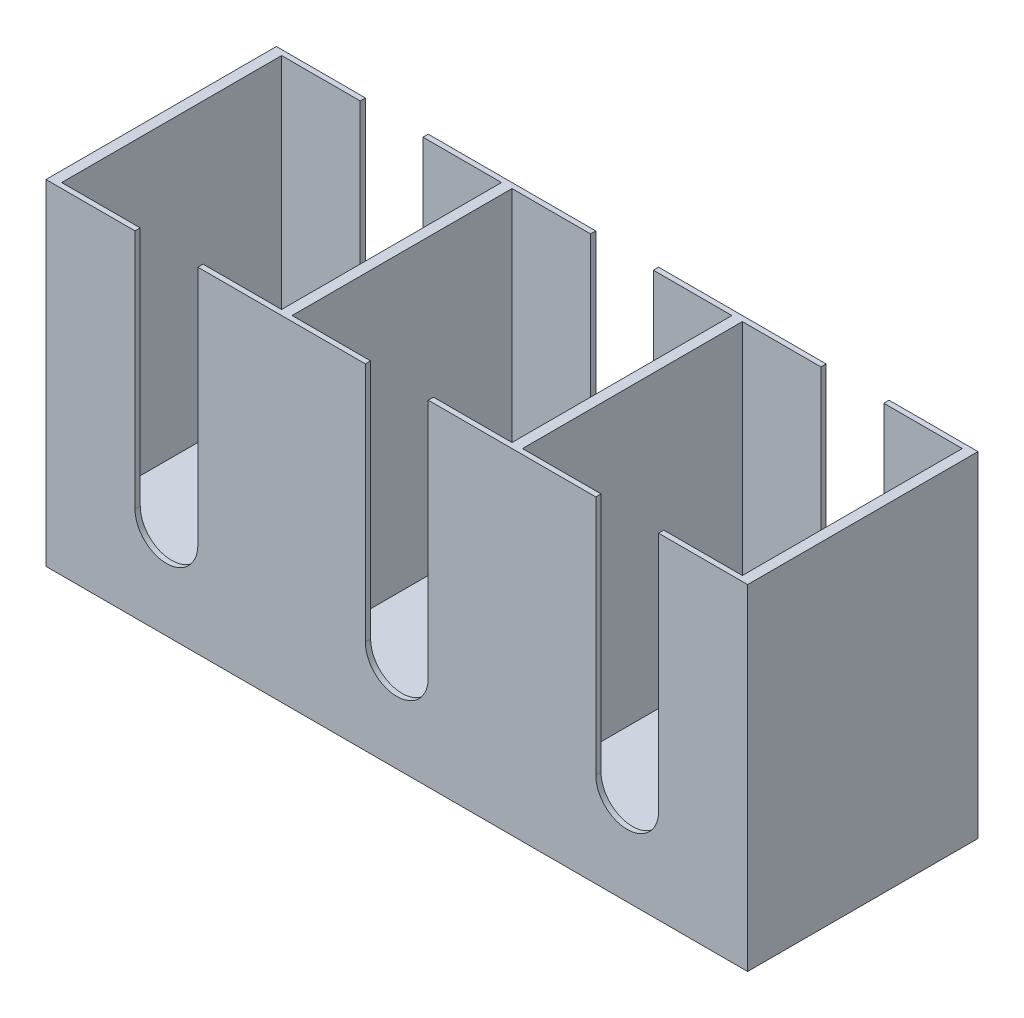
ISO-10303-21;
HEADER;
FILE_DESCRIPTION(('STEP AP214'),'2;1');
FILE_NAME('part.step','',(''),(''),'','','');
FILE_SCHEMA(('AUTOMOTIVE_DESIGN { 1 0 10303 214 1 1 1 1 }'));
ENDSEC;
DATA;
#1=APPLICATION_CONTEXT('core data for automotive mechanical design processes');
#2=APPLICATION_PROTOCOL_DEFINITION('international standard','automotive_design',2000,#1);
#3=PRODUCT_CONTEXT('',#1,'mechanical');
#4=PRODUCT('Part','Part','',(#3));
#5=PRODUCT_RELATED_PRODUCT_CATEGORY('part','',(#4));
#6=PRODUCT_DEFINITION_FORMATION('','',#4);
#7=PRODUCT_DEFINITION_CONTEXT('part definition',#1,'design');
#8=PRODUCT_DEFINITION('design','',#6,#7);
#9=PRODUCT_DEFINITION_SHAPE('','',#8);
#10=(LENGTH_UNIT() NAMED_UNIT(*) SI_UNIT(.MILLI.,.METRE.));
#11=(NAMED_UNIT(*) PLANE_ANGLE_UNIT() SI_UNIT($,.RADIAN.));
#12=(NAMED_UNIT(*) SI_UNIT($,.STERADIAN.) SOLID_ANGLE_UNIT());
#13=UNCERTAINTY_MEASURE_WITH_UNIT(LENGTH_MEASURE(1.E-05),#10,'distance_accuracy_value','');
#14=(GEOMETRIC_REPRESENTATION_CONTEXT(3) GLOBAL_UNCERTAINTY_ASSIGNED_CONTEXT((#13)) GLOBAL_UNIT_ASSIGNED_CONTEXT((#10,
#11,#12)) REPRESENTATION_CONTEXT('',''));
#15=CARTESIAN_POINT('',(0.,0.,0.));
#16=DIRECTION('',(0.,0.,1.));
#17=DIRECTION('',(1.,0.,0.));
#18=AXIS2_PLACEMENT_3D('',#15,#16,#17);
#19=CARTESIAN_POINT('',(0.,32.,0.));
#20=DIRECTION('',(0.,1.,0.));
#21=DIRECTION('',(0.,0.,1.));
#22=AXIS2_PLACEMENT_3D('',#19,#20,#21);
#23=PLANE('',#22);
#24=DIRECTION('',(0.,0.,1.));
#25=VECTOR('',#24,1.);
#26=CARTESIAN_POINT('',(-19.,32.,-11.));
#27=LINE('',#26,#25);
#28=CARTESIAN_POINT('',(-19.,32.,10.5));
#29=VERTEX_POINT('',#28);
#30=CARTESIAN_POINT('',(-19.,32.,11.));
#31=VERTEX_POINT('',#30);
#32=EDGE_CURVE('E624',#29,#31,#27,.T.);
#33=ORIENTED_EDGE('',*,*,#32,.T.);
#34=DIRECTION('',(1.,0.,0.));
#35=VECTOR('',#34,1.);
#36=CARTESIAN_POINT('',(-33.5,32.,11.));
#37=LINE('',#36,#35);
#38=CARTESIAN_POINT('',(-2.99999999999999,32.,11.));
#39=VERTEX_POINT('',#38);
#40=EDGE_CURVE('E596',#31,#39,#37,.T.);
#41=ORIENTED_EDGE('',*,*,#40,.T.);
#42=DIRECTION('',(0.,0.,1.));
#43=VECTOR('',#42,1.);
#44=CARTESIAN_POINT('',(-2.99999999999999,32.,-11.));
#45=LINE('',#44,#43);
#46=CARTESIAN_POINT('',(-2.99999999999999,32.,10.5));
#47=VERTEX_POINT('',#46);
#48=EDGE_CURVE('E367',#47,#39,#45,.T.);
#49=ORIENTED_EDGE('',*,*,#48,.F.);
#50=DIRECTION('',(1.,0.,0.));
#51=VECTOR('',#50,1.);
#52=CARTESIAN_POINT('',(-10.5,32.,10.5));
#53=LINE('',#52,#51);
#54=CARTESIAN_POINT('',(-10.5,32.,10.5));
#55=VERTEX_POINT('',#54);
#56=EDGE_CURVE('E501',#55,#47,#53,.T.);
#57=ORIENTED_EDGE('',*,*,#56,.F.);
#58=DIRECTION('',(0.,0.,1.));
#59=VECTOR('',#58,1.);
#60=CARTESIAN_POINT('',(-10.5,32.,-10.5));
#61=LINE('',#60,#59);
#62=CARTESIAN_POINT('',(-10.5,32.,-10.5));
#63=VERTEX_POINT('',#62);
#64=EDGE_CURVE('E509',#63,#55,#61,.T.);
#65=ORIENTED_EDGE('',*,*,#64,.F.);
#66=DIRECTION('',(-1.,0.,0.));
#67=VECTOR('',#66,1.);
#68=CARTESIAN_POINT('',(-10.5,32.,-10.5));
#69=LINE('',#68,#67);
#70=CARTESIAN_POINT('',(-3.,32.,-10.5));
#71=VERTEX_POINT('',#70);
#72=EDGE_CURVE('E506',#71,#63,#69,.T.);
#73=ORIENTED_EDGE('',*,*,#72,.F.);
#74=CARTESIAN_POINT('',(-2.99999999999999,32.,-11.));
#75=VERTEX_POINT('',#74);
#76=EDGE_CURVE('E65',#75,#71,#45,.T.);
#77=ORIENTED_EDGE('',*,*,#76,.F.);
#78=DIRECTION('',(-1.,0.,0.));
#79=VECTOR('',#78,1.);
#80=CARTESIAN_POINT('',(-33.5,32.,-11.));
#81=LINE('',#80,#79);
#82=CARTESIAN_POINT('',(-19.,32.,-11.));
#83=VERTEX_POINT('',#82);
#84=EDGE_CURVE('E325',#75,#83,#81,.T.);
#85=ORIENTED_EDGE('',*,*,#84,.T.);
#86=CARTESIAN_POINT('',(-19.,32.,-10.5));
#87=VERTEX_POINT('',#86);
#88=EDGE_CURVE('E406',#83,#87,#27,.T.);
#89=ORIENTED_EDGE('',*,*,#88,.T.);
#90=DIRECTION('',(-1.,0.,0.));
#91=VECTOR('',#90,1.);
#92=CARTESIAN_POINT('',(-32.5,32.,-10.5));
#93=LINE('',#92,#91);
#94=CARTESIAN_POINT('',(-11.5,32.,-10.5));
#95=VERTEX_POINT('',#94);
#96=EDGE_CURVE('E479',#95,#87,#93,.T.);
#97=ORIENTED_EDGE('',*,*,#96,.F.);
#98=DIRECTION('',(0.,0.,-1.));
#99=VECTOR('',#98,1.);
#100=CARTESIAN_POINT('',(-11.5,32.,-10.5));
#101=LINE('',#100,#99);
#102=CARTESIAN_POINT('',(-11.5,32.,10.5));
#103=VERTEX_POINT('',#102);
#104=EDGE_CURVE('E477',#103,#95,#101,.T.);
#105=ORIENTED_EDGE('',*,*,#104,.F.);
#106=DIRECTION('',(1.,0.,0.));
#107=VECTOR('',#106,1.);
#108=CARTESIAN_POINT('',(-32.5,32.,10.5));
#109=LINE('',#108,#107);
#110=EDGE_CURVE('E485',#29,#103,#109,.T.);
#111=ORIENTED_EDGE('',*,*,#110,.F.);
#112=EDGE_LOOP('',(#33,#41,#49,#57,#65,#73,#77,#85,#89,#97,#105,#111));
#113=FACE_BOUND('',#112,.T.);
#114=ADVANCED_FACE('F42',(#113),#23,.T.);
#115=DIRECTION('',(0.,0.,1.));
#116=VECTOR('',#115,1.);
#117=CARTESIAN_POINT('',(3.,32.,-11.));
#118=LINE('',#117,#116);
#119=CARTESIAN_POINT('',(3.,32.,10.5));
#120=VERTEX_POINT('',#119);
#121=CARTESIAN_POINT('',(3.,32.,11.));
#122=VERTEX_POINT('',#121);
#123=EDGE_CURVE('E397',#120,#122,#118,.T.);
#124=ORIENTED_EDGE('',*,*,#123,.T.);
#125=CARTESIAN_POINT('',(19.,32.,11.));
#126=VERTEX_POINT('',#125);
#127=EDGE_CURVE('E707',#122,#126,#37,.T.);
#128=ORIENTED_EDGE('',*,*,#127,.T.);
#129=DIRECTION('',(0.,0.,1.));
#130=VECTOR('',#129,1.);
#131=CARTESIAN_POINT('',(19.,32.,-11.));
#132=LINE('',#131,#130);
#133=CARTESIAN_POINT('',(19.,32.,10.5));
#134=VERTEX_POINT('',#133);
#135=EDGE_CURVE('E377',#134,#126,#132,.T.);
#136=ORIENTED_EDGE('',*,*,#135,.F.);
#137=DIRECTION('',(1.,0.,0.));
#138=VECTOR('',#137,1.);
#139=CARTESIAN_POINT('',(11.5,32.,10.5));
#140=LINE('',#139,#138);
#141=CARTESIAN_POINT('',(11.5,32.,10.5));
#142=VERTEX_POINT('',#141);
#143=EDGE_CURVE('E455',#142,#134,#140,.T.);
#144=ORIENTED_EDGE('',*,*,#143,.F.);
#145=DIRECTION('',(0.,0.,1.));
#146=VECTOR('',#145,1.);
#147=CARTESIAN_POINT('',(11.5,32.,-10.5));
#148=LINE('',#147,#146);
#149=CARTESIAN_POINT('',(11.5,32.,-10.5));
#150=VERTEX_POINT('',#149);
#151=EDGE_CURVE('E464',#150,#142,#148,.T.);
#152=ORIENTED_EDGE('',*,*,#151,.F.);
#153=DIRECTION('',(-1.,0.,0.));
#154=VECTOR('',#153,1.);
#155=CARTESIAN_POINT('',(11.5,32.,-10.5));
#156=LINE('',#155,#154);
#157=CARTESIAN_POINT('',(19.,32.,-10.5));
#158=VERTEX_POINT('',#157);
#159=EDGE_CURVE('E460',#158,#150,#156,.T.);
#160=ORIENTED_EDGE('',*,*,#159,.F.);
#161=CARTESIAN_POINT('',(19.,32.,-11.));
#162=VERTEX_POINT('',#161);
#163=EDGE_CURVE('E351',#162,#158,#132,.T.);
#164=ORIENTED_EDGE('',*,*,#163,.F.);
#165=CARTESIAN_POINT('',(3.,32.,-11.));
#166=VERTEX_POINT('',#165);
#167=EDGE_CURVE('E330',#162,#166,#81,.T.);
#168=ORIENTED_EDGE('',*,*,#167,.T.);
#169=CARTESIAN_POINT('',(3.,32.,-10.5));
#170=VERTEX_POINT('',#169);
#171=EDGE_CURVE('E348',#166,#170,#118,.T.);
#172=ORIENTED_EDGE('',*,*,#171,.T.);
#173=CARTESIAN_POINT('',(10.5,32.,-10.5));
#174=VERTEX_POINT('',#173);
#175=EDGE_CURVE('E507',#174,#170,#69,.T.);
#176=ORIENTED_EDGE('',*,*,#175,.F.);
#177=DIRECTION('',(0.,0.,-1.));
#178=VECTOR('',#177,1.);
#179=CARTESIAN_POINT('',(10.5,32.,-10.5));
#180=LINE('',#179,#178);
#181=CARTESIAN_POINT('',(10.5,32.,10.5));
#182=VERTEX_POINT('',#181);
#183=EDGE_CURVE('E504',#182,#174,#180,.T.);
#184=ORIENTED_EDGE('',*,*,#183,.F.);
#185=EDGE_CURVE('E500',#120,#182,#53,.T.);
#186=ORIENTED_EDGE('',*,*,#185,.F.);
#187=EDGE_LOOP('',(#124,#128,#136,#144,#152,#160,#164,#168,#172,#176,#184,#186));
#188=FACE_BOUND('',#187,.T.);
#189=ADVANCED_FACE('F346',(#188),#23,.T.);
#190=DIRECTION('',(0.,0.,1.));
#191=VECTOR('',#190,1.);
#192=CARTESIAN_POINT('',(25.,32.,-11.));
#193=LINE('',#192,#191);
#194=CARTESIAN_POINT('',(25.,32.,10.5));
#195=VERTEX_POINT('',#194);
#196=CARTESIAN_POINT('',(25.,32.,11.));
#197=VERTEX_POINT('',#196);
#198=EDGE_CURVE('E388',#195,#197,#193,.T.);
#199=ORIENTED_EDGE('',*,*,#198,.T.);
#200=CARTESIAN_POINT('',(33.5,32.,11.));
#201=VERTEX_POINT('',#200);
#202=EDGE_CURVE('E339',#197,#201,#37,.T.);
#203=ORIENTED_EDGE('',*,*,#202,.T.);
#204=DIRECTION('',(0.,0.,-1.));
#205=VECTOR('',#204,1.);
#206=CARTESIAN_POINT('',(33.5,32.,-11.));
#207=LINE('',#206,#205);
#208=CARTESIAN_POINT('',(33.5,32.,-11.));
#209=VERTEX_POINT('',#208);
#210=EDGE_CURVE('E326',#201,#209,#207,.T.);
#211=ORIENTED_EDGE('',*,*,#210,.T.);
#212=CARTESIAN_POINT('',(25.,32.,-11.));
#213=VERTEX_POINT('',#212);
#214=EDGE_CURVE('E328',#209,#213,#81,.T.);
#215=ORIENTED_EDGE('',*,*,#214,.T.);
#216=CARTESIAN_POINT('',(25.,32.,-10.5));
#217=VERTEX_POINT('',#216);
#218=EDGE_CURVE('E386',#213,#217,#193,.T.);
#219=ORIENTED_EDGE('',*,*,#218,.T.);
#220=CARTESIAN_POINT('',(32.5,32.,-10.5));
#221=VERTEX_POINT('',#220);
#222=EDGE_CURVE('E461',#221,#217,#156,.T.);
#223=ORIENTED_EDGE('',*,*,#222,.F.);
#224=DIRECTION('',(0.,0.,-1.));
#225=VECTOR('',#224,1.);
#226=CARTESIAN_POINT('',(32.5,32.,-10.5));
#227=LINE('',#226,#225);
#228=CARTESIAN_POINT('',(32.5,32.,10.5));
#229=VERTEX_POINT('',#228);
#230=EDGE_CURVE('E458',#229,#221,#227,.T.);
#231=ORIENTED_EDGE('',*,*,#230,.F.);
#232=EDGE_CURVE('E454',#195,#229,#140,.T.);
#233=ORIENTED_EDGE('',*,*,#232,.F.);
#234=EDGE_LOOP('',(#199,#203,#211,#215,#219,#223,#231,#233));
#235=FACE_BOUND('',#234,.T.);
#236=ADVANCED_FACE('F683',(#235),#23,.T.);
#237=DIRECTION('',(0.,0.,1.));
#238=VECTOR('',#237,1.);
#239=CARTESIAN_POINT('',(-25.,32.,-11.));
#240=LINE('',#239,#238);
#241=CARTESIAN_POINT('',(-25.,32.,-11.));
#242=VERTEX_POINT('',#241);
#243=CARTESIAN_POINT('',(-25.,32.,-10.5));
#244=VERTEX_POINT('',#243);
#245=EDGE_CURVE('E300',#242,#244,#240,.T.);
#246=ORIENTED_EDGE('',*,*,#245,.F.);
#247=CARTESIAN_POINT('',(-33.5,32.,-11.));
#248=VERTEX_POINT('',#247);
#249=EDGE_CURVE('E314',#242,#248,#81,.T.);
#250=ORIENTED_EDGE('',*,*,#249,.T.);
#251=DIRECTION('',(0.,0.,1.));
#252=VECTOR('',#251,1.);
#253=CARTESIAN_POINT('',(-33.5,32.,-11.));
#254=LINE('',#253,#252);
#255=CARTESIAN_POINT('',(-33.5,32.,11.));
#256=VERTEX_POINT('',#255);
#257=EDGE_CURVE('E336',#248,#256,#254,.T.);
#258=ORIENTED_EDGE('',*,*,#257,.T.);
#259=CARTESIAN_POINT('',(-25.,32.,11.));
#260=VERTEX_POINT('',#259);
#261=EDGE_CURVE('E535',#256,#260,#37,.T.);
#262=ORIENTED_EDGE('',*,*,#261,.T.);
#263=CARTESIAN_POINT('',(-25.,32.,10.5));
#264=VERTEX_POINT('',#263);
#265=EDGE_CURVE('E319',#264,#260,#240,.T.);
#266=ORIENTED_EDGE('',*,*,#265,.F.);
#267=CARTESIAN_POINT('',(-32.5,32.,10.5));
#268=VERTEX_POINT('',#267);
#269=EDGE_CURVE('E486',#268,#264,#109,.T.);
#270=ORIENTED_EDGE('',*,*,#269,.F.);
#271=DIRECTION('',(0.,0.,1.));
#272=VECTOR('',#271,1.);
#273=CARTESIAN_POINT('',(-32.5,32.,-10.5));
#274=LINE('',#273,#272);
#275=CARTESIAN_POINT('',(-32.5,32.,-10.5));
#276=VERTEX_POINT('',#275);
#277=EDGE_CURVE('E482',#276,#268,#274,.T.);
#278=ORIENTED_EDGE('',*,*,#277,.F.);
#279=EDGE_CURVE('E317',#244,#276,#93,.T.);
#280=ORIENTED_EDGE('',*,*,#279,.F.);
#281=EDGE_LOOP('',(#246,#250,#258,#262,#266,#270,#278,#280));
#282=FACE_BOUND('',#281,.T.);
#283=ADVANCED_FACE('F313',(#282),#23,.T.);
#284=CARTESIAN_POINT('',(0.,0.,0.));
#285=DIRECTION('',(0.,1.,0.));
#286=DIRECTION('',(0.,0.,1.));
#287=AXIS2_PLACEMENT_3D('',#284,#285,#286);
#288=PLANE('',#287);
#289=DIRECTION('',(0.,0.,-1.));
#290=VECTOR('',#289,1.);
#291=CARTESIAN_POINT('',(33.5,0.,-11.));
#292=LINE('',#291,#290);
#293=CARTESIAN_POINT('',(33.5,0.,11.));
#294=VERTEX_POINT('',#293);
#295=CARTESIAN_POINT('',(33.5,0.,-11.));
#296=VERTEX_POINT('',#295);
#297=EDGE_CURVE('E521',#294,#296,#292,.T.);
#298=ORIENTED_EDGE('',*,*,#297,.F.);
#299=DIRECTION('',(1.,0.,0.));
#300=VECTOR('',#299,1.);
#301=CARTESIAN_POINT('',(-33.5,0.,11.));
#302=LINE('',#301,#300);
#303=CARTESIAN_POINT('',(-33.5,0.,11.));
#304=VERTEX_POINT('',#303);
#305=EDGE_CURVE('E332',#304,#294,#302,.T.);
#306=ORIENTED_EDGE('',*,*,#305,.F.);
#307=DIRECTION('',(0.,0.,1.));
#308=VECTOR('',#307,1.);
#309=CARTESIAN_POINT('',(-33.5,0.,-11.));
#310=LINE('',#309,#308);
#311=CARTESIAN_POINT('',(-33.5,0.,-11.));
#312=VERTEX_POINT('',#311);
#313=EDGE_CURVE('E532',#312,#304,#310,.T.);
#314=ORIENTED_EDGE('',*,*,#313,.F.);
#315=DIRECTION('',(-1.,0.,0.));
#316=VECTOR('',#315,1.);
#317=CARTESIAN_POINT('',(-33.5,0.,-11.));
#318=LINE('',#317,#316);
#319=EDGE_CURVE('E526',#296,#312,#318,.T.);
#320=ORIENTED_EDGE('',*,*,#319,.F.);
#321=EDGE_LOOP('',(#298,#306,#314,#320));
#322=FACE_BOUND('',#321,.T.);
#323=ADVANCED_FACE('F687',(#322),#288,.F.);
#324=CARTESIAN_POINT('',(33.5,32.,-11.));
#325=DIRECTION('',(-1.,0.,0.));
#326=DIRECTION('',(0.,0.,1.));
#327=AXIS2_PLACEMENT_3D('',#324,#325,#326);
#328=PLANE('',#327);
#329=ORIENTED_EDGE('',*,*,#297,.T.);
#330=DIRECTION('',(0.,-1.,0.));
#331=VECTOR('',#330,1.);
#332=CARTESIAN_POINT('',(33.5,32.,-11.));
#333=LINE('',#332,#331);
#334=EDGE_CURVE('E545',#209,#296,#333,.T.);
#335=ORIENTED_EDGE('',*,*,#334,.F.);
#336=ORIENTED_EDGE('',*,*,#210,.F.);
#337=DIRECTION('',(0.,-1.,0.));
#338=VECTOR('',#337,1.);
#339=CARTESIAN_POINT('',(33.5,32.,11.));
#340=LINE('',#339,#338);
#341=EDGE_CURVE('E539',#201,#294,#340,.T.);
#342=ORIENTED_EDGE('',*,*,#341,.T.);
#343=EDGE_LOOP('',(#329,#335,#336,#342));
#344=FACE_BOUND('',#343,.T.);
#345=ADVANCED_FACE('F44',(#344),#328,.F.);
#346=CARTESIAN_POINT('',(-33.5,32.,-11.));
#347=DIRECTION('',(0.,0.,1.));
#348=DIRECTION('',(1.,0.,0.));
#349=AXIS2_PLACEMENT_3D('',#346,#347,#348);
#350=PLANE('',#349);
#351=CARTESIAN_POINT('',(-22.,9.,-11.));
#352=DIRECTION('',(0.,0.,1.));
#353=DIRECTION('',(1.,0.,0.));
#354=AXIS2_PLACEMENT_3D('',#351,#352,#353);
#355=CIRCLE('',#354,3.);
#356=CARTESIAN_POINT('',(-25.,9.,-11.));
#357=VERTEX_POINT('',#356);
#358=CARTESIAN_POINT('',(-19.,9.,-11.));
#359=VERTEX_POINT('',#358);
#360=EDGE_CURVE('E308',#357,#359,#355,.T.);
#361=ORIENTED_EDGE('',*,*,#360,.T.);
#362=DIRECTION('',(0.,1.,0.));
#363=VECTOR('',#362,1.);
#364=CARTESIAN_POINT('',(-19.,9.,-11.));
#365=LINE('',#364,#363);
#366=EDGE_CURVE('E618',#359,#83,#365,.T.);
#367=ORIENTED_EDGE('',*,*,#366,.T.);
#368=ORIENTED_EDGE('',*,*,#84,.F.);
#369=DIRECTION('',(0.,-1.,0.));
#370=VECTOR('',#369,1.);
#371=CARTESIAN_POINT('',(-2.99999999999999,32.,-11.));
#372=LINE('',#371,#370);
#373=CARTESIAN_POINT('',(-3.,9.,-11.));
#374=VERTEX_POINT('',#373);
#375=EDGE_CURVE('E365',#75,#374,#372,.T.);
#376=ORIENTED_EDGE('',*,*,#375,.T.);
#377=CARTESIAN_POINT('',(0.,9.,-11.));
#378=DIRECTION('',(0.,0.,1.));
#379=DIRECTION('',(1.,0.,0.));
#380=AXIS2_PLACEMENT_3D('',#377,#378,#379);
#381=CIRCLE('',#380,3.);
#382=CARTESIAN_POINT('',(3.00000000000001,9.,-11.));
#383=VERTEX_POINT('',#382);
#384=EDGE_CURVE('E361',#374,#383,#381,.T.);
#385=ORIENTED_EDGE('',*,*,#384,.T.);
#386=DIRECTION('',(0.,1.,0.));
#387=VECTOR('',#386,1.);
#388=CARTESIAN_POINT('',(3.,9.,-11.));
#389=LINE('',#388,#387);
#390=EDGE_CURVE('E358',#383,#166,#389,.T.);
#391=ORIENTED_EDGE('',*,*,#390,.T.);
#392=ORIENTED_EDGE('',*,*,#167,.F.);
#393=DIRECTION('',(0.,-1.,0.));
#394=VECTOR('',#393,1.);
#395=CARTESIAN_POINT('',(19.,32.,-11.));
#396=LINE('',#395,#394);
#397=CARTESIAN_POINT('',(19.,9.,-11.));
#398=VERTEX_POINT('',#397);
#399=EDGE_CURVE('E355',#162,#398,#396,.T.);
#400=ORIENTED_EDGE('',*,*,#399,.T.);
#401=CARTESIAN_POINT('',(22.,9.,-11.));
#402=DIRECTION('',(0.,0.,1.));
#403=DIRECTION('',(1.,0.,0.));
#404=AXIS2_PLACEMENT_3D('',#401,#402,#403);
#405=CIRCLE('',#404,3.);
#406=CARTESIAN_POINT('',(25.,9.,-11.));
#407=VERTEX_POINT('',#406);
#408=EDGE_CURVE('E400',#398,#407,#405,.T.);
#409=ORIENTED_EDGE('',*,*,#408,.T.);
#410=DIRECTION('',(0.,1.,0.));
#411=VECTOR('',#410,1.);
#412=CARTESIAN_POINT('',(25.,9.,-11.));
#413=LINE('',#412,#411);
#414=EDGE_CURVE('E376',#407,#213,#413,.T.);
#415=ORIENTED_EDGE('',*,*,#414,.T.);
#416=ORIENTED_EDGE('',*,*,#214,.F.);
#417=ORIENTED_EDGE('',*,*,#334,.T.);
#418=ORIENTED_EDGE('',*,*,#319,.T.);
#419=DIRECTION('',(0.,-1.,0.));
#420=VECTOR('',#419,1.);
#421=CARTESIAN_POINT('',(-33.5,32.,-11.));
#422=LINE('',#421,#420);
#423=EDGE_CURVE('E323',#248,#312,#422,.T.);
#424=ORIENTED_EDGE('',*,*,#423,.F.);
#425=ORIENTED_EDGE('',*,*,#249,.F.);
#426=DIRECTION('',(0.,-1.,0.));
#427=VECTOR('',#426,1.);
#428=CARTESIAN_POINT('',(-25.,32.,-11.));
#429=LINE('',#428,#427);
#430=EDGE_CURVE('E297',#242,#357,#429,.T.);
#431=ORIENTED_EDGE('',*,*,#430,.T.);
#432=EDGE_LOOP('',(#361,#367,#368,#376,#385,#391,#392,#400,#409,#415,#416,#417,#418,#424,#425,#431));
#433=FACE_BOUND('',#432,.T.);
#434=ADVANCED_FACE('F321',(#433),#350,.F.);
#435=CARTESIAN_POINT('',(-33.5,32.,-11.));
#436=DIRECTION('',(1.,0.,0.));
#437=DIRECTION('',(0.,0.,-1.));
#438=AXIS2_PLACEMENT_3D('',#435,#436,#437);
#439=PLANE('',#438);
#440=ORIENTED_EDGE('',*,*,#313,.T.);
#441=DIRECTION('',(0.,-1.,0.));
#442=VECTOR('',#441,1.);
#443=CARTESIAN_POINT('',(-33.5,32.,11.));
#444=LINE('',#443,#442);
#445=EDGE_CURVE('E541',#256,#304,#444,.T.);
#446=ORIENTED_EDGE('',*,*,#445,.F.);
#447=ORIENTED_EDGE('',*,*,#257,.F.);
#448=ORIENTED_EDGE('',*,*,#423,.T.);
#449=EDGE_LOOP('',(#440,#446,#447,#448));
#450=FACE_BOUND('',#449,.T.);
#451=ADVANCED_FACE('F768',(#450),#439,.F.);
#452=CARTESIAN_POINT('',(-33.5,32.,11.));
#453=DIRECTION('',(0.,0.,-1.));
#454=DIRECTION('',(-1.,0.,0.));
#455=AXIS2_PLACEMENT_3D('',#452,#453,#454);
#456=PLANE('',#455);
#457=ORIENTED_EDGE('',*,*,#40,.F.);
#458=DIRECTION('',(0.,1.,0.));
#459=VECTOR('',#458,1.);
#460=CARTESIAN_POINT('',(-19.,9.,11.));
#461=LINE('',#460,#459);
#462=CARTESIAN_POINT('',(-19.,9.,11.));
#463=VERTEX_POINT('',#462);
#464=EDGE_CURVE('E309',#463,#31,#461,.T.);
#465=ORIENTED_EDGE('',*,*,#464,.F.);
#466=CARTESIAN_POINT('',(-22.,9.,11.));
#467=DIRECTION('',(0.,0.,1.));
#468=DIRECTION('',(1.,0.,0.));
#469=AXIS2_PLACEMENT_3D('',#466,#467,#468);
#470=CIRCLE('',#469,3.);
#471=CARTESIAN_POINT('',(-25.,9.,11.));
#472=VERTEX_POINT('',#471);
#473=EDGE_CURVE('E610',#472,#463,#470,.T.);
#474=ORIENTED_EDGE('',*,*,#473,.F.);
#475=DIRECTION('',(0.,-1.,0.));
#476=VECTOR('',#475,1.);
#477=CARTESIAN_POINT('',(-25.,32.,11.));
#478=LINE('',#477,#476);
#479=EDGE_CURVE('E608',#260,#472,#478,.T.);
#480=ORIENTED_EDGE('',*,*,#479,.F.);
#481=ORIENTED_EDGE('',*,*,#261,.F.);
#482=ORIENTED_EDGE('',*,*,#445,.T.);
#483=ORIENTED_EDGE('',*,*,#305,.T.);
#484=ORIENTED_EDGE('',*,*,#341,.F.);
#485=ORIENTED_EDGE('',*,*,#202,.F.);
#486=DIRECTION('',(0.,1.,0.));
#487=VECTOR('',#486,1.);
#488=CARTESIAN_POINT('',(25.,9.,11.));
#489=LINE('',#488,#487);
#490=CARTESIAN_POINT('',(25.,9.,11.));
#491=VERTEX_POINT('',#490);
#492=EDGE_CURVE('E389',#491,#197,#489,.T.);
#493=ORIENTED_EDGE('',*,*,#492,.F.);
#494=CARTESIAN_POINT('',(22.,9.,11.));
#495=DIRECTION('',(0.,0.,1.));
#496=DIRECTION('',(1.,0.,0.));
#497=AXIS2_PLACEMENT_3D('',#494,#495,#496);
#498=CIRCLE('',#497,3.);
#499=CARTESIAN_POINT('',(19.,9.,11.));
#500=VERTEX_POINT('',#499);
#501=EDGE_CURVE('E391',#500,#491,#498,.T.);
#502=ORIENTED_EDGE('',*,*,#501,.F.);
#503=DIRECTION('',(0.,-1.,0.));
#504=VECTOR('',#503,1.);
#505=CARTESIAN_POINT('',(19.,32.,11.));
#506=LINE('',#505,#504);
#507=EDGE_CURVE('E394',#126,#500,#506,.T.);
#508=ORIENTED_EDGE('',*,*,#507,.F.);
#509=ORIENTED_EDGE('',*,*,#127,.F.);
#510=DIRECTION('',(0.,1.,0.));
#511=VECTOR('',#510,1.);
#512=CARTESIAN_POINT('',(3.,9.,11.));
#513=LINE('',#512,#511);
#514=CARTESIAN_POINT('',(3.00000000000001,9.,11.));
#515=VERTEX_POINT('',#514);
#516=EDGE_CURVE('E374',#515,#122,#513,.T.);
#517=ORIENTED_EDGE('',*,*,#516,.F.);
#518=CARTESIAN_POINT('',(0.,9.,11.));
#519=DIRECTION('',(0.,0.,1.));
#520=DIRECTION('',(1.,0.,0.));
#521=AXIS2_PLACEMENT_3D('',#518,#519,#520);
#522=CIRCLE('',#521,3.);
#523=CARTESIAN_POINT('',(-3.,9.,11.));
#524=VERTEX_POINT('',#523);
#525=EDGE_CURVE('E602',#524,#515,#522,.T.);
#526=ORIENTED_EDGE('',*,*,#525,.F.);
#527=DIRECTION('',(0.,-1.,0.));
#528=VECTOR('',#527,1.);
#529=CARTESIAN_POINT('',(-2.99999999999999,32.,11.));
#530=LINE('',#529,#528);
#531=EDGE_CURVE('E370',#39,#524,#530,.T.);
#532=ORIENTED_EDGE('',*,*,#531,.F.);
#533=EDGE_LOOP('',(#457,#465,#474,#480,#481,#482,#483,#484,#485,#493,#502,#508,#509,#517,#526,#532));
#534=FACE_BOUND('',#533,.T.);
#535=ADVANCED_FACE('F704',(#534),#456,.F.);
#536=CARTESIAN_POINT('',(-10.5,32.,10.5));
#537=DIRECTION('',(0.,0.,-1.));
#538=DIRECTION('',(-1.,0.,0.));
#539=AXIS2_PLACEMENT_3D('',#536,#537,#538);
#540=PLANE('',#539);
#541=DIRECTION('',(0.,-1.,0.));
#542=VECTOR('',#541,1.);
#543=CARTESIAN_POINT('',(3.,32.,10.5));
#544=LINE('',#543,#542);
#545=CARTESIAN_POINT('',(3.00000000000001,9.,10.5));
#546=VERTEX_POINT('',#545);
#547=EDGE_CURVE('E421',#120,#546,#544,.T.);
#548=ORIENTED_EDGE('',*,*,#547,.F.);
#549=ORIENTED_EDGE('',*,*,#185,.T.);
#550=DIRECTION('',(0.,-1.,0.));
#551=VECTOR('',#550,1.);
#552=CARTESIAN_POINT('',(10.5,32.,10.5));
#553=LINE('',#552,#551);
#554=CARTESIAN_POINT('',(10.5,4.,10.5));
#555=VERTEX_POINT('',#554);
#556=EDGE_CURVE('E519',#182,#555,#553,.T.);
#557=ORIENTED_EDGE('',*,*,#556,.T.);
#558=DIRECTION('',(1.,0.,0.));
#559=VECTOR('',#558,1.);
#560=CARTESIAN_POINT('',(0.,4.,10.5));
#561=LINE('',#560,#559);
#562=CARTESIAN_POINT('',(-10.5,4.,10.5));
#563=VERTEX_POINT('',#562);
#564=EDGE_CURVE('E447',#563,#555,#561,.T.);
#565=ORIENTED_EDGE('',*,*,#564,.F.);
#566=DIRECTION('',(0.,-1.,0.));
#567=VECTOR('',#566,1.);
#568=CARTESIAN_POINT('',(-10.5,32.,10.5));
#569=LINE('',#568,#567);
#570=EDGE_CURVE('E511',#55,#563,#569,.T.);
#571=ORIENTED_EDGE('',*,*,#570,.F.);
#572=ORIENTED_EDGE('',*,*,#56,.T.);
#573=DIRECTION('',(0.,1.,0.));
#574=VECTOR('',#573,1.);
#575=CARTESIAN_POINT('',(-2.99999999999999,32.,10.5));
#576=LINE('',#575,#574);
#577=CARTESIAN_POINT('',(-3.,9.,10.5));
#578=VERTEX_POINT('',#577);
#579=EDGE_CURVE('E417',#578,#47,#576,.T.);
#580=ORIENTED_EDGE('',*,*,#579,.F.);
#581=CARTESIAN_POINT('',(0.,9.,10.5));
#582=DIRECTION('',(0.,0.,-1.));
#583=DIRECTION('',(-1.,0.,0.));
#584=AXIS2_PLACEMENT_3D('',#581,#582,#583);
#585=CIRCLE('',#584,3.);
#586=EDGE_CURVE('E419',#546,#578,#585,.T.);
#587=ORIENTED_EDGE('',*,*,#586,.F.);
#588=EDGE_LOOP('',(#548,#549,#557,#565,#571,#572,#580,#587));
#589=FACE_BOUND('',#588,.T.);
#590=ADVANCED_FACE('F585',(#589),#540,.T.);
#591=CARTESIAN_POINT('',(10.5,32.,-10.5));
#592=DIRECTION('',(-1.,0.,0.));
#593=DIRECTION('',(0.,0.,1.));
#594=AXIS2_PLACEMENT_3D('',#591,#592,#593);
#595=PLANE('',#594);
#596=DIRECTION('',(0.,0.,1.));
#597=VECTOR('',#596,1.);
#598=CARTESIAN_POINT('',(10.5,4.,0.));
#599=LINE('',#598,#597);
#600=CARTESIAN_POINT('',(10.5,4.,-10.5));
#601=VERTEX_POINT('',#600);
#602=EDGE_CURVE('E450',#601,#555,#599,.T.);
#603=ORIENTED_EDGE('',*,*,#602,.T.);
#604=ORIENTED_EDGE('',*,*,#556,.F.);
#605=ORIENTED_EDGE('',*,*,#183,.T.);
#606=DIRECTION('',(0.,-1.,0.));
#607=VECTOR('',#606,1.);
#608=CARTESIAN_POINT('',(10.5,32.,-10.5));
#609=LINE('',#608,#607);
#610=EDGE_CURVE('E516',#174,#601,#609,.T.);
#611=ORIENTED_EDGE('',*,*,#610,.T.);
#612=EDGE_LOOP('',(#603,#604,#605,#611));
#613=FACE_BOUND('',#612,.T.);
#614=ADVANCED_FACE('F578',(#613),#595,.T.);
#615=CARTESIAN_POINT('',(-10.5,32.,-10.5));
#616=DIRECTION('',(0.,0.,1.));
#617=DIRECTION('',(1.,0.,0.));
#618=AXIS2_PLACEMENT_3D('',#615,#616,#617);
#619=PLANE('',#618);
#620=DIRECTION('',(0.,1.,0.));
#621=VECTOR('',#620,1.);
#622=CARTESIAN_POINT('',(3.,32.,-10.5));
#623=LINE('',#622,#621);
#624=CARTESIAN_POINT('',(3.00000000000001,9.,-10.5));
#625=VERTEX_POINT('',#624);
#626=EDGE_CURVE('E11',#625,#170,#623,.T.);
#627=ORIENTED_EDGE('',*,*,#626,.F.);
#628=CARTESIAN_POINT('',(0.,9.,-10.5));
#629=DIRECTION('',(0.,0.,1.));
#630=DIRECTION('',(1.,0.,0.));
#631=AXIS2_PLACEMENT_3D('',#628,#629,#630);
#632=CIRCLE('',#631,3.);
#633=CARTESIAN_POINT('',(-3.,9.,-10.5));
#634=VERTEX_POINT('',#633);
#635=EDGE_CURVE('E50',#634,#625,#632,.T.);
#636=ORIENTED_EDGE('',*,*,#635,.F.);
#637=DIRECTION('',(0.,-1.,0.));
#638=VECTOR('',#637,1.);
#639=CARTESIAN_POINT('',(-2.99999999999999,32.,-10.5));
#640=LINE('',#639,#638);
#641=EDGE_CURVE('E561',#71,#634,#640,.T.);
#642=ORIENTED_EDGE('',*,*,#641,.F.);
#643=ORIENTED_EDGE('',*,*,#72,.T.);
#644=DIRECTION('',(0.,-1.,0.));
#645=VECTOR('',#644,1.);
#646=CARTESIAN_POINT('',(-10.5,32.,-10.5));
#647=LINE('',#646,#645);
#648=CARTESIAN_POINT('',(-10.5,4.,-10.5));
#649=VERTEX_POINT('',#648);
#650=EDGE_CURVE('E513',#63,#649,#647,.T.);
#651=ORIENTED_EDGE('',*,*,#650,.T.);
#652=DIRECTION('',(1.,0.,0.));
#653=VECTOR('',#652,1.);
#654=CARTESIAN_POINT('',(0.,4.,-10.5));
#655=LINE('',#654,#653);
#656=EDGE_CURVE('E452',#649,#601,#655,.T.);
#657=ORIENTED_EDGE('',*,*,#656,.T.);
#658=ORIENTED_EDGE('',*,*,#610,.F.);
#659=ORIENTED_EDGE('',*,*,#175,.T.);
#660=EDGE_LOOP('',(#627,#636,#642,#643,#651,#657,#658,#659));
#661=FACE_BOUND('',#660,.T.);
#662=ADVANCED_FACE('F573',(#661),#619,.T.);
#663=CARTESIAN_POINT('',(-10.5,32.,-10.5));
#664=DIRECTION('',(1.,0.,0.));
#665=DIRECTION('',(0.,0.,-1.));
#666=AXIS2_PLACEMENT_3D('',#663,#664,#665);
#667=PLANE('',#666);
#668=DIRECTION('',(0.,0.,1.));
#669=VECTOR('',#668,1.);
#670=CARTESIAN_POINT('',(-10.5,4.,0.));
#671=LINE('',#670,#669);
#672=EDGE_CURVE('E444',#649,#563,#671,.T.);
#673=ORIENTED_EDGE('',*,*,#672,.F.);
#674=ORIENTED_EDGE('',*,*,#650,.F.);
#675=ORIENTED_EDGE('',*,*,#64,.T.);
#676=ORIENTED_EDGE('',*,*,#570,.T.);
#677=EDGE_LOOP('',(#673,#674,#675,#676));
#678=FACE_BOUND('',#677,.T.);
#679=ADVANCED_FACE('F786',(#678),#667,.T.);
#680=CARTESIAN_POINT('',(-11.5,32.,-10.5));
#681=DIRECTION('',(-1.,0.,0.));
#682=DIRECTION('',(0.,0.,1.));
#683=AXIS2_PLACEMENT_3D('',#680,#681,#682);
#684=PLANE('',#683);
#685=DIRECTION('',(0.,0.,1.));
#686=VECTOR('',#685,1.);
#687=CARTESIAN_POINT('',(-11.5,4.,0.));
#688=LINE('',#687,#686);
#689=CARTESIAN_POINT('',(-11.5,4.,-10.5));
#690=VERTEX_POINT('',#689);
#691=CARTESIAN_POINT('',(-11.5,4.,10.5));
#692=VERTEX_POINT('',#691);
#693=EDGE_CURVE('E433',#690,#692,#688,.T.);
#694=ORIENTED_EDGE('',*,*,#693,.T.);
#695=DIRECTION('',(0.,-1.,0.));
#696=VECTOR('',#695,1.);
#697=CARTESIAN_POINT('',(-11.5,32.,10.5));
#698=LINE('',#697,#696);
#699=EDGE_CURVE('E489',#103,#692,#698,.T.);
#700=ORIENTED_EDGE('',*,*,#699,.F.);
#701=ORIENTED_EDGE('',*,*,#104,.T.);
#702=DIRECTION('',(0.,-1.,0.));
#703=VECTOR('',#702,1.);
#704=CARTESIAN_POINT('',(-11.5,32.,-10.5));
#705=LINE('',#704,#703);
#706=EDGE_CURVE('E497',#95,#690,#705,.T.);
#707=ORIENTED_EDGE('',*,*,#706,.T.);
#708=EDGE_LOOP('',(#694,#700,#701,#707));
#709=FACE_BOUND('',#708,.T.);
#710=ADVANCED_FACE('F657',(#709),#684,.T.);
#711=CARTESIAN_POINT('',(-32.5,32.,-10.5));
#712=DIRECTION('',(0.,0.,1.));
#713=DIRECTION('',(1.,0.,0.));
#714=AXIS2_PLACEMENT_3D('',#711,#712,#713);
#715=PLANE('',#714);
#716=DIRECTION('',(0.,1.,0.));
#717=VECTOR('',#716,1.);
#718=CARTESIAN_POINT('',(-19.,32.,-10.5));
#719=LINE('',#718,#717);
#720=CARTESIAN_POINT('',(-19.,9.,-10.5));
#721=VERTEX_POINT('',#720);
#722=EDGE_CURVE('E415',#721,#87,#719,.T.);
#723=ORIENTED_EDGE('',*,*,#722,.F.);
#724=CARTESIAN_POINT('',(-22.,9.,-10.5));
#725=DIRECTION('',(0.,0.,1.));
#726=DIRECTION('',(1.,0.,0.));
#727=AXIS2_PLACEMENT_3D('',#724,#725,#726);
#728=CIRCLE('',#727,3.);
#729=CARTESIAN_POINT('',(-25.,9.,-10.5));
#730=VERTEX_POINT('',#729);
#731=EDGE_CURVE('E413',#730,#721,#728,.T.);
#732=ORIENTED_EDGE('',*,*,#731,.F.);
#733=DIRECTION('',(0.,-1.,0.));
#734=VECTOR('',#733,1.);
#735=CARTESIAN_POINT('',(-25.,32.,-10.5));
#736=LINE('',#735,#734);
#737=EDGE_CURVE('E411',#244,#730,#736,.T.);
#738=ORIENTED_EDGE('',*,*,#737,.F.);
#739=ORIENTED_EDGE('',*,*,#279,.T.);
#740=DIRECTION('',(0.,-1.,0.));
#741=VECTOR('',#740,1.);
#742=CARTESIAN_POINT('',(-32.5,32.,-10.5));
#743=LINE('',#742,#741);
#744=CARTESIAN_POINT('',(-32.5,4.,-10.5));
#745=VERTEX_POINT('',#744);
#746=EDGE_CURVE('E494',#276,#745,#743,.T.);
#747=ORIENTED_EDGE('',*,*,#746,.T.);
#748=DIRECTION('',(1.,0.,0.));
#749=VECTOR('',#748,1.);
#750=CARTESIAN_POINT('',(0.,4.,-10.5));
#751=LINE('',#750,#749);
#752=EDGE_CURVE('E436',#745,#690,#751,.T.);
#753=ORIENTED_EDGE('',*,*,#752,.T.);
#754=ORIENTED_EDGE('',*,*,#706,.F.);
#755=ORIENTED_EDGE('',*,*,#96,.T.);
#756=EDGE_LOOP('',(#723,#732,#738,#739,#747,#753,#754,#755));
#757=FACE_BOUND('',#756,.T.);
#758=ADVANCED_FACE('F650',(#757),#715,.T.);
#759=CARTESIAN_POINT('',(-32.5,32.,-10.5));
#760=DIRECTION('',(1.,0.,0.));
#761=DIRECTION('',(0.,0.,-1.));
#762=AXIS2_PLACEMENT_3D('',#759,#760,#761);
#763=PLANE('',#762);
#764=DIRECTION('',(0.,0.,1.));
#765=VECTOR('',#764,1.);
#766=CARTESIAN_POINT('',(-32.5,4.,0.));
#767=LINE('',#766,#765);
#768=CARTESIAN_POINT('',(-32.5,4.,10.5));
#769=VERTEX_POINT('',#768);
#770=EDGE_CURVE('E438',#745,#769,#767,.T.);
#771=ORIENTED_EDGE('',*,*,#770,.F.);
#772=ORIENTED_EDGE('',*,*,#746,.F.);
#773=ORIENTED_EDGE('',*,*,#277,.T.);
#774=DIRECTION('',(0.,-1.,0.));
#775=VECTOR('',#774,1.);
#776=CARTESIAN_POINT('',(-32.5,32.,10.5));
#777=LINE('',#776,#775);
#778=EDGE_CURVE('E491',#268,#769,#777,.T.);
#779=ORIENTED_EDGE('',*,*,#778,.T.);
#780=EDGE_LOOP('',(#771,#772,#773,#779));
#781=FACE_BOUND('',#780,.T.);
#782=ADVANCED_FACE('F646',(#781),#763,.T.);
#783=CARTESIAN_POINT('',(-32.5,32.,10.5));
#784=DIRECTION('',(0.,0.,-1.));
#785=DIRECTION('',(-1.,0.,0.));
#786=AXIS2_PLACEMENT_3D('',#783,#784,#785);
#787=PLANE('',#786);
#788=DIRECTION('',(0.,-1.,0.));
#789=VECTOR('',#788,1.);
#790=CARTESIAN_POINT('',(-19.,32.,10.5));
#791=LINE('',#790,#789);
#792=CARTESIAN_POINT('',(-19.,9.,10.5));
#793=VERTEX_POINT('',#792);
#794=EDGE_CURVE('E559',#29,#793,#791,.T.);
#795=ORIENTED_EDGE('',*,*,#794,.F.);
#796=ORIENTED_EDGE('',*,*,#110,.T.);
#797=ORIENTED_EDGE('',*,*,#699,.T.);
#798=DIRECTION('',(1.,0.,0.));
#799=VECTOR('',#798,1.);
#800=CARTESIAN_POINT('',(0.,4.,10.5));
#801=LINE('',#800,#799);
#802=EDGE_CURVE('E441',#769,#692,#801,.T.);
#803=ORIENTED_EDGE('',*,*,#802,.F.);
#804=ORIENTED_EDGE('',*,*,#778,.F.);
#805=ORIENTED_EDGE('',*,*,#269,.T.);
#806=DIRECTION('',(0.,1.,0.));
#807=VECTOR('',#806,1.);
#808=CARTESIAN_POINT('',(-25.,32.,10.5));
#809=LINE('',#808,#807);
#810=CARTESIAN_POINT('',(-25.,9.,10.5));
#811=VERTEX_POINT('',#810);
#812=EDGE_CURVE('E554',#811,#264,#809,.T.);
#813=ORIENTED_EDGE('',*,*,#812,.F.);
#814=CARTESIAN_POINT('',(-22.,9.,10.5));
#815=DIRECTION('',(0.,0.,-1.));
#816=DIRECTION('',(-1.,0.,0.));
#817=AXIS2_PLACEMENT_3D('',#814,#815,#816);
#818=CIRCLE('',#817,3.);
#819=EDGE_CURVE('E556',#793,#811,#818,.T.);
#820=ORIENTED_EDGE('',*,*,#819,.F.);
#821=EDGE_LOOP('',(#795,#796,#797,#803,#804,#805,#813,#820));
#822=FACE_BOUND('',#821,.T.);
#823=ADVANCED_FACE('F643',(#822),#787,.T.);
#824=CARTESIAN_POINT('',(11.5,32.,10.5));
#825=DIRECTION('',(0.,0.,-1.));
#826=DIRECTION('',(-1.,0.,0.));
#827=AXIS2_PLACEMENT_3D('',#824,#825,#826);
#828=PLANE('',#827);
#829=DIRECTION('',(0.,-1.,0.));
#830=VECTOR('',#829,1.);
#831=CARTESIAN_POINT('',(25.,32.,10.5));
#832=LINE('',#831,#830);
#833=CARTESIAN_POINT('',(25.,9.,10.5));
#834=VERTEX_POINT('',#833);
#835=EDGE_CURVE('E409',#195,#834,#832,.T.);
#836=ORIENTED_EDGE('',*,*,#835,.F.);
#837=ORIENTED_EDGE('',*,*,#232,.T.);
#838=DIRECTION('',(0.,-1.,0.));
#839=VECTOR('',#838,1.);
#840=CARTESIAN_POINT('',(32.5,32.,10.5));
#841=LINE('',#840,#839);
#842=CARTESIAN_POINT('',(32.5,4.,10.5));
#843=VERTEX_POINT('',#842);
#844=EDGE_CURVE('E474',#229,#843,#841,.T.);
#845=ORIENTED_EDGE('',*,*,#844,.T.);
#846=DIRECTION('',(1.,0.,0.));
#847=VECTOR('',#846,1.);
#848=CARTESIAN_POINT('',(0.,4.,10.5));
#849=LINE('',#848,#847);
#850=CARTESIAN_POINT('',(11.5,4.,10.5));
#851=VERTEX_POINT('',#850);
#852=EDGE_CURVE('E426',#851,#843,#849,.T.);
#853=ORIENTED_EDGE('',*,*,#852,.F.);
#854=DIRECTION('',(0.,-1.,0.));
#855=VECTOR('',#854,1.);
#856=CARTESIAN_POINT('',(11.5,32.,10.5));
#857=LINE('',#856,#855);
#858=EDGE_CURVE('E466',#142,#851,#857,.T.);
#859=ORIENTED_EDGE('',*,*,#858,.F.);
#860=ORIENTED_EDGE('',*,*,#143,.T.);
#861=DIRECTION('',(0.,1.,0.));
#862=VECTOR('',#861,1.);
#863=CARTESIAN_POINT('',(19.,32.,10.5));
#864=LINE('',#863,#862);
#865=CARTESIAN_POINT('',(19.,9.,10.5));
#866=VERTEX_POINT('',#865);
#867=EDGE_CURVE('E403',#866,#134,#864,.T.);
#868=ORIENTED_EDGE('',*,*,#867,.F.);
#869=CARTESIAN_POINT('',(22.,9.,10.5));
#870=DIRECTION('',(0.,0.,-1.));
#871=DIRECTION('',(-1.,0.,0.));
#872=AXIS2_PLACEMENT_3D('',#869,#870,#871);
#873=CIRCLE('',#872,3.);
#874=EDGE_CURVE('E405',#834,#866,#873,.T.);
#875=ORIENTED_EDGE('',*,*,#874,.F.);
#876=EDGE_LOOP('',(#836,#837,#845,#853,#859,#860,#868,#875));
#877=FACE_BOUND('',#876,.T.);
#878=ADVANCED_FACE('F718',(#877),#828,.T.);
#879=CARTESIAN_POINT('',(32.5,32.,-10.5));
#880=DIRECTION('',(-1.,0.,0.));
#881=DIRECTION('',(0.,0.,1.));
#882=AXIS2_PLACEMENT_3D('',#879,#880,#881);
#883=PLANE('',#882);
#884=DIRECTION('',(0.,0.,1.));
#885=VECTOR('',#884,1.);
#886=CARTESIAN_POINT('',(32.5,4.,0.));
#887=LINE('',#886,#885);
#888=CARTESIAN_POINT('',(32.5,4.,-10.5));
#889=VERTEX_POINT('',#888);
#890=EDGE_CURVE('E429',#889,#843,#887,.T.);
#891=ORIENTED_EDGE('',*,*,#890,.T.);
#892=ORIENTED_EDGE('',*,*,#844,.F.);
#893=ORIENTED_EDGE('',*,*,#230,.T.);
#894=DIRECTION('',(0.,-1.,0.));
#895=VECTOR('',#894,1.);
#896=CARTESIAN_POINT('',(32.5,32.,-10.5));
#897=LINE('',#896,#895);
#898=EDGE_CURVE('E471',#221,#889,#897,.T.);
#899=ORIENTED_EDGE('',*,*,#898,.T.);
#900=EDGE_LOOP('',(#891,#892,#893,#899));
#901=FACE_BOUND('',#900,.T.);
#902=ADVANCED_FACE('F736',(#901),#883,.T.);
#903=CARTESIAN_POINT('',(11.5,32.,-10.5));
#904=DIRECTION('',(0.,0.,1.));
#905=DIRECTION('',(1.,0.,0.));
#906=AXIS2_PLACEMENT_3D('',#903,#904,#905);
#907=PLANE('',#906);
#908=DIRECTION('',(0.,1.,0.));
#909=VECTOR('',#908,1.);
#910=CARTESIAN_POINT('',(25.,32.,-10.5));
#911=LINE('',#910,#909);
#912=CARTESIAN_POINT('',(25.,9.,-10.5));
#913=VERTEX_POINT('',#912);
#914=EDGE_CURVE('E552',#913,#217,#911,.T.);
#915=ORIENTED_EDGE('',*,*,#914,.F.);
#916=CARTESIAN_POINT('',(22.,9.,-10.5));
#917=DIRECTION('',(0.,0.,1.));
#918=DIRECTION('',(1.,0.,0.));
#919=AXIS2_PLACEMENT_3D('',#916,#917,#918);
#920=CIRCLE('',#919,3.);
#921=CARTESIAN_POINT('',(19.,9.,-10.5));
#922=VERTEX_POINT('',#921);
#923=EDGE_CURVE('E550',#922,#913,#920,.T.);
#924=ORIENTED_EDGE('',*,*,#923,.F.);
#925=DIRECTION('',(0.,-1.,0.));
#926=VECTOR('',#925,1.);
#927=CARTESIAN_POINT('',(19.,32.,-10.5));
#928=LINE('',#927,#926);
#929=EDGE_CURVE('E548',#158,#922,#928,.T.);
#930=ORIENTED_EDGE('',*,*,#929,.F.);
#931=ORIENTED_EDGE('',*,*,#159,.T.);
#932=DIRECTION('',(0.,-1.,0.));
#933=VECTOR('',#932,1.);
#934=CARTESIAN_POINT('',(11.5,32.,-10.5));
#935=LINE('',#934,#933);
#936=CARTESIAN_POINT('',(11.5,4.,-10.5));
#937=VERTEX_POINT('',#936);
#938=EDGE_CURVE('E468',#150,#937,#935,.T.);
#939=ORIENTED_EDGE('',*,*,#938,.T.);
#940=DIRECTION('',(1.,0.,0.));
#941=VECTOR('',#940,1.);
#942=CARTESIAN_POINT('',(0.,4.,-10.5));
#943=LINE('',#942,#941);
#944=EDGE_CURVE('E431',#937,#889,#943,.T.);
#945=ORIENTED_EDGE('',*,*,#944,.T.);
#946=ORIENTED_EDGE('',*,*,#898,.F.);
#947=ORIENTED_EDGE('',*,*,#222,.T.);
#948=EDGE_LOOP('',(#915,#924,#930,#931,#939,#945,#946,#947));
#949=FACE_BOUND('',#948,.T.);
#950=ADVANCED_FACE('F728',(#949),#907,.T.);
#951=CARTESIAN_POINT('',(11.5,32.,-10.5));
#952=DIRECTION('',(1.,0.,0.));
#953=DIRECTION('',(0.,0.,-1.));
#954=AXIS2_PLACEMENT_3D('',#951,#952,#953);
#955=PLANE('',#954);
#956=DIRECTION('',(0.,0.,1.));
#957=VECTOR('',#956,1.);
#958=CARTESIAN_POINT('',(11.5,4.,0.));
#959=LINE('',#958,#957);
#960=EDGE_CURVE('E423',#937,#851,#959,.T.);
#961=ORIENTED_EDGE('',*,*,#960,.F.);
#962=ORIENTED_EDGE('',*,*,#938,.F.);
#963=ORIENTED_EDGE('',*,*,#151,.T.);
#964=ORIENTED_EDGE('',*,*,#858,.T.);
#965=EDGE_LOOP('',(#961,#962,#963,#964));
#966=FACE_BOUND('',#965,.T.);
#967=ADVANCED_FACE('F724',(#966),#955,.T.);
#968=CARTESIAN_POINT('',(0.,4.,0.));
#969=DIRECTION('',(0.,1.,0.));
#970=DIRECTION('',(0.,0.,1.));
#971=AXIS2_PLACEMENT_3D('',#968,#969,#970);
#972=PLANE('',#971);
#973=ORIENTED_EDGE('',*,*,#672,.T.);
#974=ORIENTED_EDGE('',*,*,#564,.T.);
#975=ORIENTED_EDGE('',*,*,#602,.F.);
#976=ORIENTED_EDGE('',*,*,#656,.F.);
#977=EDGE_LOOP('',(#973,#974,#975,#976));
#978=FACE_BOUND('',#977,.T.);
#979=ADVANCED_FACE('F582',(#978),#972,.T.);
#980=CARTESIAN_POINT('',(0.,4.,0.));
#981=DIRECTION('',(0.,1.,0.));
#982=DIRECTION('',(0.,0.,1.));
#983=AXIS2_PLACEMENT_3D('',#980,#981,#982);
#984=PLANE('',#983);
#985=ORIENTED_EDGE('',*,*,#693,.F.);
#986=ORIENTED_EDGE('',*,*,#752,.F.);
#987=ORIENTED_EDGE('',*,*,#770,.T.);
#988=ORIENTED_EDGE('',*,*,#802,.T.);
#989=EDGE_LOOP('',(#985,#986,#987,#988));
#990=FACE_BOUND('',#989,.T.);
#991=ADVANCED_FACE('F654',(#990),#984,.T.);
#992=CARTESIAN_POINT('',(0.,4.,0.));
#993=DIRECTION('',(0.,1.,0.));
#994=DIRECTION('',(0.,0.,1.));
#995=AXIS2_PLACEMENT_3D('',#992,#993,#994);
#996=PLANE('',#995);
#997=ORIENTED_EDGE('',*,*,#960,.T.);
#998=ORIENTED_EDGE('',*,*,#852,.T.);
#999=ORIENTED_EDGE('',*,*,#890,.F.);
#1000=ORIENTED_EDGE('',*,*,#944,.F.);
#1001=EDGE_LOOP('',(#997,#998,#999,#1000));
#1002=FACE_BOUND('',#1001,.T.);
#1003=ADVANCED_FACE('F733',(#1002),#996,.T.);
#1004=CARTESIAN_POINT('',(19.,32.,-11.));
#1005=DIRECTION('',(-1.,0.,0.));
#1006=DIRECTION('',(0.,-1.,0.));
#1007=AXIS2_PLACEMENT_3D('',#1004,#1005,#1006);
#1008=PLANE('',#1007);
#1009=ORIENTED_EDGE('',*,*,#929,.T.);
#1010=DIRECTION('',(0.,0.,1.));
#1011=VECTOR('',#1010,1.);
#1012=CARTESIAN_POINT('',(19.,9.,-11.));
#1013=LINE('',#1012,#1011);
#1014=EDGE_CURVE('E378',#398,#922,#1013,.T.);
#1015=ORIENTED_EDGE('',*,*,#1014,.F.);
#1016=ORIENTED_EDGE('',*,*,#399,.F.);
#1017=ORIENTED_EDGE('',*,*,#163,.T.);
#1018=EDGE_LOOP('',(#1009,#1015,#1016,#1017));
#1019=FACE_BOUND('',#1018,.T.);
#1020=ADVANCED_FACE('F749',(#1019),#1008,.F.);
#1021=CARTESIAN_POINT('',(22.,9.,-11.));
#1022=DIRECTION('',(0.,0.,1.));
#1023=DIRECTION('',(1.,0.,0.));
#1024=AXIS2_PLACEMENT_3D('',#1021,#1022,#1023);
#1025=CYLINDRICAL_SURFACE('',#1024,3.);
#1026=ORIENTED_EDGE('',*,*,#923,.T.);
#1027=DIRECTION('',(0.,0.,1.));
#1028=VECTOR('',#1027,1.);
#1029=CARTESIAN_POINT('',(25.,9.,-11.));
#1030=LINE('',#1029,#1028);
#1031=EDGE_CURVE('E382',#407,#913,#1030,.T.);
#1032=ORIENTED_EDGE('',*,*,#1031,.F.);
#1033=ORIENTED_EDGE('',*,*,#408,.F.);
#1034=ORIENTED_EDGE('',*,*,#1014,.T.);
#1035=EDGE_LOOP('',(#1026,#1032,#1033,#1034));
#1036=FACE_BOUND('',#1035,.T.);
#1037=ADVANCED_FACE('F743',(#1036),#1025,.F.);
#1038=CARTESIAN_POINT('',(25.,9.,-11.));
#1039=DIRECTION('',(1.,0.,0.));
#1040=DIRECTION('',(0.,0.,-1.));
#1041=AXIS2_PLACEMENT_3D('',#1038,#1039,#1040);
#1042=PLANE('',#1041);
#1043=ORIENTED_EDGE('',*,*,#914,.T.);
#1044=ORIENTED_EDGE('',*,*,#218,.F.);
#1045=ORIENTED_EDGE('',*,*,#414,.F.);
#1046=ORIENTED_EDGE('',*,*,#1031,.T.);
#1047=EDGE_LOOP('',(#1043,#1044,#1045,#1046));
#1048=FACE_BOUND('',#1047,.T.);
#1049=ADVANCED_FACE('F750',(#1048),#1042,.F.);
#1050=ORIENTED_EDGE('',*,*,#835,.T.);
#1051=EDGE_CURVE('E385',#834,#491,#1030,.T.);
#1052=ORIENTED_EDGE('',*,*,#1051,.T.);
#1053=ORIENTED_EDGE('',*,*,#492,.T.);
#1054=ORIENTED_EDGE('',*,*,#198,.F.);
#1055=EDGE_LOOP('',(#1050,#1052,#1053,#1054));
#1056=FACE_BOUND('',#1055,.T.);
#1057=ADVANCED_FACE('F738',(#1056),#1042,.F.);
#1058=ORIENTED_EDGE('',*,*,#874,.T.);
#1059=EDGE_CURVE('E381',#866,#500,#1013,.T.);
#1060=ORIENTED_EDGE('',*,*,#1059,.T.);
#1061=ORIENTED_EDGE('',*,*,#501,.T.);
#1062=ORIENTED_EDGE('',*,*,#1051,.F.);
#1063=EDGE_LOOP('',(#1058,#1060,#1061,#1062));
#1064=FACE_BOUND('',#1063,.T.);
#1065=ADVANCED_FACE('F740',(#1064),#1025,.F.);
#1066=ORIENTED_EDGE('',*,*,#867,.T.);
#1067=ORIENTED_EDGE('',*,*,#135,.T.);
#1068=ORIENTED_EDGE('',*,*,#507,.T.);
#1069=ORIENTED_EDGE('',*,*,#1059,.F.);
#1070=EDGE_LOOP('',(#1066,#1067,#1068,#1069));
#1071=FACE_BOUND('',#1070,.T.);
#1072=ADVANCED_FACE('F714',(#1071),#1008,.F.);
#1073=CARTESIAN_POINT('',(-25.,32.,-11.));
#1074=DIRECTION('',(-1.,0.,0.));
#1075=DIRECTION('',(0.,-1.,0.));
#1076=AXIS2_PLACEMENT_3D('',#1073,#1074,#1075);
#1077=PLANE('',#1076);
#1078=ORIENTED_EDGE('',*,*,#812,.T.);
#1079=ORIENTED_EDGE('',*,*,#265,.T.);
#1080=ORIENTED_EDGE('',*,*,#479,.T.);
#1081=DIRECTION('',(0.,0.,1.));
#1082=VECTOR('',#1081,1.);
#1083=CARTESIAN_POINT('',(-25.,9.,-11.));
#1084=LINE('',#1083,#1082);
#1085=EDGE_CURVE('E318',#811,#472,#1084,.T.);
#1086=ORIENTED_EDGE('',*,*,#1085,.F.);
#1087=EDGE_LOOP('',(#1078,#1079,#1080,#1086));
#1088=FACE_BOUND('',#1087,.T.);
#1089=ADVANCED_FACE('F636',(#1088),#1077,.F.);
#1090=CARTESIAN_POINT('',(-22.,9.,-11.));
#1091=DIRECTION('',(0.,0.,1.));
#1092=DIRECTION('',(1.,0.,0.));
#1093=AXIS2_PLACEMENT_3D('',#1090,#1091,#1092);
#1094=CYLINDRICAL_SURFACE('',#1093,3.);
#1095=ORIENTED_EDGE('',*,*,#819,.T.);
#1096=ORIENTED_EDGE('',*,*,#1085,.T.);
#1097=ORIENTED_EDGE('',*,*,#473,.T.);
#1098=DIRECTION('',(0.,0.,1.));
#1099=VECTOR('',#1098,1.);
#1100=CARTESIAN_POINT('',(-19.,9.,-11.));
#1101=LINE('',#1100,#1099);
#1102=EDGE_CURVE('E627',#793,#463,#1101,.T.);
#1103=ORIENTED_EDGE('',*,*,#1102,.F.);
#1104=EDGE_LOOP('',(#1095,#1096,#1097,#1103));
#1105=FACE_BOUND('',#1104,.T.);
#1106=ADVANCED_FACE('F631',(#1105),#1094,.F.);
#1107=CARTESIAN_POINT('',(-19.,9.,-11.));
#1108=DIRECTION('',(1.,0.,0.));
#1109=DIRECTION('',(0.,0.,-1.));
#1110=AXIS2_PLACEMENT_3D('',#1107,#1108,#1109);
#1111=PLANE('',#1110);
#1112=ORIENTED_EDGE('',*,*,#794,.T.);
#1113=ORIENTED_EDGE('',*,*,#1102,.T.);
#1114=ORIENTED_EDGE('',*,*,#464,.T.);
#1115=ORIENTED_EDGE('',*,*,#32,.F.);
#1116=EDGE_LOOP('',(#1112,#1113,#1114,#1115));
#1117=FACE_BOUND('',#1116,.T.);
#1118=ADVANCED_FACE('F675',(#1117),#1111,.F.);
#1119=ORIENTED_EDGE('',*,*,#722,.T.);
#1120=ORIENTED_EDGE('',*,*,#88,.F.);
#1121=ORIENTED_EDGE('',*,*,#366,.F.);
#1122=EDGE_CURVE('E625',#359,#721,#1101,.T.);
#1123=ORIENTED_EDGE('',*,*,#1122,.T.);
#1124=EDGE_LOOP('',(#1119,#1120,#1121,#1123));
#1125=FACE_BOUND('',#1124,.T.);
#1126=ADVANCED_FACE('F665',(#1125),#1111,.F.);
#1127=ORIENTED_EDGE('',*,*,#731,.T.);
#1128=ORIENTED_EDGE('',*,*,#1122,.F.);
#1129=ORIENTED_EDGE('',*,*,#360,.F.);
#1130=EDGE_CURVE('E303',#357,#730,#1084,.T.);
#1131=ORIENTED_EDGE('',*,*,#1130,.T.);
#1132=EDGE_LOOP('',(#1127,#1128,#1129,#1131));
#1133=FACE_BOUND('',#1132,.T.);
#1134=ADVANCED_FACE('F666',(#1133),#1094,.F.);
#1135=ORIENTED_EDGE('',*,*,#737,.T.);
#1136=ORIENTED_EDGE('',*,*,#1130,.F.);
#1137=ORIENTED_EDGE('',*,*,#430,.F.);
#1138=ORIENTED_EDGE('',*,*,#245,.T.);
#1139=EDGE_LOOP('',(#1135,#1136,#1137,#1138));
#1140=FACE_BOUND('',#1139,.T.);
#1141=ADVANCED_FACE('F299',(#1140),#1077,.F.);
#1142=CARTESIAN_POINT('',(-2.99999999999999,32.,-11.));
#1143=DIRECTION('',(-1.,0.,0.));
#1144=DIRECTION('',(0.,-1.,0.));
#1145=AXIS2_PLACEMENT_3D('',#1142,#1143,#1144);
#1146=PLANE('',#1145);
#1147=ORIENTED_EDGE('',*,*,#641,.T.);
#1148=DIRECTION('',(0.,0.,1.));
#1149=VECTOR('',#1148,1.);
#1150=CARTESIAN_POINT('',(-3.,9.,-11.));
#1151=LINE('',#1150,#1149);
#1152=EDGE_CURVE('E567',#374,#634,#1151,.T.);
#1153=ORIENTED_EDGE('',*,*,#1152,.F.);
#1154=ORIENTED_EDGE('',*,*,#375,.F.);
#1155=ORIENTED_EDGE('',*,*,#76,.T.);
#1156=EDGE_LOOP('',(#1147,#1153,#1154,#1155));
#1157=FACE_BOUND('',#1156,.T.);
#1158=ADVANCED_FACE('F673',(#1157),#1146,.F.);
#1159=CARTESIAN_POINT('',(0.,9.,-11.));
#1160=DIRECTION('',(0.,0.,1.));
#1161=DIRECTION('',(1.,0.,0.));
#1162=AXIS2_PLACEMENT_3D('',#1159,#1160,#1161);
#1163=CYLINDRICAL_SURFACE('',#1162,3.);
#1164=ORIENTED_EDGE('',*,*,#635,.T.);
#1165=DIRECTION('',(0.,0.,1.));
#1166=VECTOR('',#1165,1.);
#1167=CARTESIAN_POINT('',(3.00000000000001,9.,-11.));
#1168=LINE('',#1167,#1166);
#1169=EDGE_CURVE('E566',#383,#625,#1168,.T.);
#1170=ORIENTED_EDGE('',*,*,#1169,.F.);
#1171=ORIENTED_EDGE('',*,*,#384,.F.);
#1172=ORIENTED_EDGE('',*,*,#1152,.T.);
#1173=EDGE_LOOP('',(#1164,#1170,#1171,#1172));
#1174=FACE_BOUND('',#1173,.T.);
#1175=ADVANCED_FACE('F565',(#1174),#1163,.F.);
#1176=CARTESIAN_POINT('',(3.,9.,-11.));
#1177=DIRECTION('',(1.,0.,0.));
#1178=DIRECTION('',(0.,0.,-1.));
#1179=AXIS2_PLACEMENT_3D('',#1176,#1177,#1178);
#1180=PLANE('',#1179);
#1181=ORIENTED_EDGE('',*,*,#626,.T.);
#1182=ORIENTED_EDGE('',*,*,#171,.F.);
#1183=ORIENTED_EDGE('',*,*,#390,.F.);
#1184=ORIENTED_EDGE('',*,*,#1169,.T.);
#1185=EDGE_LOOP('',(#1181,#1182,#1183,#1184));
#1186=FACE_BOUND('',#1185,.T.);
#1187=ADVANCED_FACE('F570',(#1186),#1180,.F.);
#1188=ORIENTED_EDGE('',*,*,#547,.T.);
#1189=EDGE_CURVE('E571',#546,#515,#1168,.T.);
#1190=ORIENTED_EDGE('',*,*,#1189,.T.);
#1191=ORIENTED_EDGE('',*,*,#516,.T.);
#1192=ORIENTED_EDGE('',*,*,#123,.F.);
#1193=EDGE_LOOP('',(#1188,#1190,#1191,#1192));
#1194=FACE_BOUND('',#1193,.T.);
#1195=ADVANCED_FACE('F909',(#1194),#1180,.F.);
#1196=ORIENTED_EDGE('',*,*,#586,.T.);
#1197=EDGE_CURVE('E57',#578,#524,#1151,.T.);
#1198=ORIENTED_EDGE('',*,*,#1197,.T.);
#1199=ORIENTED_EDGE('',*,*,#525,.T.);
#1200=ORIENTED_EDGE('',*,*,#1189,.F.);
#1201=EDGE_LOOP('',(#1196,#1198,#1199,#1200));
#1202=FACE_BOUND('',#1201,.T.);
#1203=ADVANCED_FACE('F901',(#1202),#1163,.F.);
#1204=ORIENTED_EDGE('',*,*,#579,.T.);
#1205=ORIENTED_EDGE('',*,*,#48,.T.);
#1206=ORIENTED_EDGE('',*,*,#531,.T.);
#1207=ORIENTED_EDGE('',*,*,#1197,.F.);
#1208=EDGE_LOOP('',(#1204,#1205,#1206,#1207));
#1209=FACE_BOUND('',#1208,.T.);
#1210=ADVANCED_FACE('F892',(#1209),#1146,.F.);
#1211=CLOSED_SHELL('',(#114,#189,#236,#283,#323,#345,#434,#451,#535,#590,#614,#662,#679,#710,
#758,#782,#823,#878,#902,#950,#967,#979,#991,#1003,#1020,#1037,#1049,#1057,#1065,#1072,#1089,
#1106,#1118,#1126,#1134,#1141,#1158,#1175,#1187,#1195,#1203,#1210));
#1212=MANIFOLD_SOLID_BREP('B2',#1211);
#1213=ADVANCED_BREP_SHAPE_REPRESENTATION('',(#18,#1212),#14);
#1214=SHAPE_DEFINITION_REPRESENTATION(#9,#1213);
ENDSEC;
END-ISO-10303-21;
